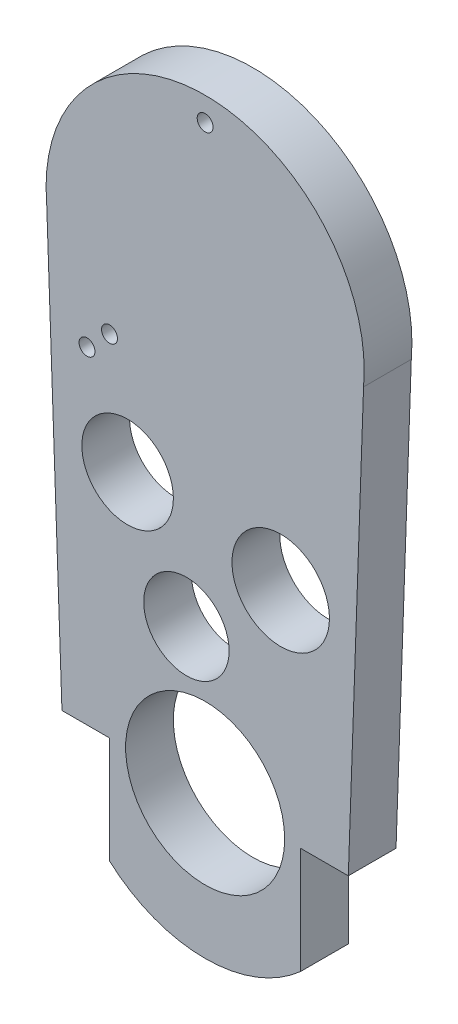
ISO-10303-21;
HEADER;
FILE_DESCRIPTION(('STEP AP214'),'2;1');
FILE_NAME('part.step','',(''),(''),'','','');
FILE_SCHEMA(('AUTOMOTIVE_DESIGN { 1 0 10303 214 1 1 1 1 }'));
ENDSEC;
DATA;
#1=APPLICATION_CONTEXT('core data for automotive mechanical design processes');
#2=APPLICATION_PROTOCOL_DEFINITION('international standard','automotive_design',2000,#1);
#3=PRODUCT_CONTEXT('',#1,'mechanical');
#4=PRODUCT('Part','Part','',(#3));
#5=PRODUCT_RELATED_PRODUCT_CATEGORY('part','',(#4));
#6=PRODUCT_DEFINITION_FORMATION('','',#4);
#7=PRODUCT_DEFINITION_CONTEXT('part definition',#1,'design');
#8=PRODUCT_DEFINITION('design','',#6,#7);
#9=PRODUCT_DEFINITION_SHAPE('','',#8);
#10=(LENGTH_UNIT() NAMED_UNIT(*) SI_UNIT(.MILLI.,.METRE.));
#11=(NAMED_UNIT(*) PLANE_ANGLE_UNIT() SI_UNIT($,.RADIAN.));
#12=(NAMED_UNIT(*) SI_UNIT($,.STERADIAN.) SOLID_ANGLE_UNIT());
#13=UNCERTAINTY_MEASURE_WITH_UNIT(LENGTH_MEASURE(1.E-05),#10,'distance_accuracy_value','');
#14=(GEOMETRIC_REPRESENTATION_CONTEXT(3) GLOBAL_UNCERTAINTY_ASSIGNED_CONTEXT((#13)) GLOBAL_UNIT_ASSIGNED_CONTEXT((#10,
#11,#12)) REPRESENTATION_CONTEXT('',''));
#15=CARTESIAN_POINT('',(0.,0.,0.));
#16=DIRECTION('',(0.,0.,1.));
#17=DIRECTION('',(1.,0.,0.));
#18=AXIS2_PLACEMENT_3D('',#15,#16,#17);
#19=CARTESIAN_POINT('',(0.,28.,3.));
#20=DIRECTION('',(0.,0.,-1.));
#21=DIRECTION('',(-1.,0.,0.));
#22=AXIS2_PLACEMENT_3D('',#19,#20,#21);
#23=PLANE('',#22);
#24=CARTESIAN_POINT('',(0.,28.,3.));
#25=DIRECTION('',(0.,0.,1.));
#26=DIRECTION('',(-1.,0.,0.));
#27=AXIS2_PLACEMENT_3D('',#24,#25,#26);
#28=CIRCLE('',#27,10.);
#29=CARTESIAN_POINT('',(9.95907170702906,27.0961799215256,3.));
#30=VERTEX_POINT('',#29);
#31=CARTESIAN_POINT('',(-9.95907170702906,27.0961799215256,3.));
#32=VERTEX_POINT('',#31);
#33=EDGE_CURVE('E151',#30,#32,#28,.T.);
#34=ORIENTED_EDGE('',*,*,#33,.T.);
#35=DIRECTION('',(0.0353729383723889,-0.999374181791236,0.));
#36=VECTOR('',#35,1.);
#37=CARTESIAN_POINT('',(-9.,0.,3.));
#38=LINE('',#37,#36);
#39=CARTESIAN_POINT('',(-9.,0.,3.));
#40=VERTEX_POINT('',#39);
#41=EDGE_CURVE('E99',#32,#40,#38,.T.);
#42=ORIENTED_EDGE('',*,*,#41,.T.);
#43=DIRECTION('',(1.,0.,0.));
#44=VECTOR('',#43,1.);
#45=CARTESIAN_POINT('',(-6.,0.,3.));
#46=LINE('',#45,#44);
#47=CARTESIAN_POINT('',(-6.,0.,3.));
#48=VERTEX_POINT('',#47);
#49=EDGE_CURVE('E166',#40,#48,#46,.T.);
#50=ORIENTED_EDGE('',*,*,#49,.T.);
#51=DIRECTION('',(0.,-1.,0.));
#52=VECTOR('',#51,1.);
#53=CARTESIAN_POINT('',(-6.,-6.70820393249937,3.));
#54=LINE('',#53,#52);
#55=CARTESIAN_POINT('',(-6.,-6.70820393249937,3.));
#56=VERTEX_POINT('',#55);
#57=EDGE_CURVE('E179',#48,#56,#54,.T.);
#58=ORIENTED_EDGE('',*,*,#57,.T.);
#59=CARTESIAN_POINT('',(0.,0.,3.));
#60=DIRECTION('',(0.,0.,1.));
#61=DIRECTION('',(1.,0.,0.));
#62=AXIS2_PLACEMENT_3D('',#59,#60,#61);
#63=CIRCLE('',#62,9.);
#64=CARTESIAN_POINT('',(6.,-6.70820393249937,3.));
#65=VERTEX_POINT('',#64);
#66=EDGE_CURVE('E118',#56,#65,#63,.T.);
#67=ORIENTED_EDGE('',*,*,#66,.T.);
#68=DIRECTION('',(0.,1.,0.));
#69=VECTOR('',#68,1.);
#70=CARTESIAN_POINT('',(6.,-6.70820393249937,3.));
#71=LINE('',#70,#69);
#72=CARTESIAN_POINT('',(6.,0.,3.));
#73=VERTEX_POINT('',#72);
#74=EDGE_CURVE('E112',#65,#73,#71,.T.);
#75=ORIENTED_EDGE('',*,*,#74,.T.);
#76=DIRECTION('',(1.,0.,0.));
#77=VECTOR('',#76,1.);
#78=CARTESIAN_POINT('',(6.,0.,3.));
#79=LINE('',#78,#77);
#80=CARTESIAN_POINT('',(9.,0.,3.));
#81=VERTEX_POINT('',#80);
#82=EDGE_CURVE('E116',#73,#81,#79,.T.);
#83=ORIENTED_EDGE('',*,*,#82,.T.);
#84=DIRECTION('',(0.0353729383723889,0.999374181791236,0.));
#85=VECTOR('',#84,1.);
#86=CARTESIAN_POINT('',(9.,0.,3.));
#87=LINE('',#86,#85);
#88=EDGE_CURVE('E56',#81,#30,#87,.T.);
#89=ORIENTED_EDGE('',*,*,#88,.T.);
#90=EDGE_LOOP('',(#34,#42,#50,#58,#67,#75,#83,#89));
#91=FACE_BOUND('',#90,.T.);
#92=CARTESIAN_POINT('',(0.,0.,3.));
#93=DIRECTION('',(0.,0.,1.));
#94=DIRECTION('',(1.,0.,0.));
#95=AXIS2_PLACEMENT_3D('',#92,#93,#94);
#96=CIRCLE('',#95,5.);
#97=CARTESIAN_POINT('',(5.,0.,3.));
#98=VERTEX_POINT('',#97);
#99=EDGE_CURVE('E140',#98,#98,#96,.T.);
#100=ORIENTED_EDGE('',*,*,#99,.F.);
#101=EDGE_LOOP('',(#100));
#102=FACE_BOUND('',#101,.T.);
#103=CARTESIAN_POINT('',(-4.87423041916293,15.0480677752898,3.));
#104=DIRECTION('',(0.,0.,1.));
#105=DIRECTION('',(1.,0.,0.));
#106=AXIS2_PLACEMENT_3D('',#103,#104,#105);
#107=CIRCLE('',#106,2.87750647764229);
#108=CARTESIAN_POINT('',(-1.99672394152064,15.0480677752898,3.));
#109=VERTEX_POINT('',#108);
#110=EDGE_CURVE('E188',#109,#109,#107,.T.);
#111=ORIENTED_EDGE('',*,*,#110,.F.);
#112=EDGE_LOOP('',(#111));
#113=FACE_BOUND('',#112,.T.);
#114=CARTESIAN_POINT('',(4.75073652574446,13.4161529645615,3.));
#115=DIRECTION('',(0.,0.,1.));
#116=DIRECTION('',(1.,0.,0.));
#117=AXIS2_PLACEMENT_3D('',#114,#115,#116);
#118=CIRCLE('',#117,3.0634845054764);
#119=CARTESIAN_POINT('',(7.81422103122086,13.4161529645615,3.));
#120=VERTEX_POINT('',#119);
#121=EDGE_CURVE('E194',#120,#120,#118,.T.);
#122=ORIENTED_EDGE('',*,*,#121,.F.);
#123=EDGE_LOOP('',(#122));
#124=FACE_BOUND('',#123,.T.);
#125=CARTESIAN_POINT('',(-1.17744380710507,8.48710414848437,3.));
#126=DIRECTION('',(0.,0.,1.));
#127=DIRECTION('',(1.,0.,0.));
#128=AXIS2_PLACEMENT_3D('',#125,#126,#127);
#129=CIRCLE('',#128,2.6843256323907);
#130=CARTESIAN_POINT('',(1.50688182528563,8.48710414848437,3.));
#131=VERTEX_POINT('',#130);
#132=EDGE_CURVE('E200',#131,#131,#129,.T.);
#133=ORIENTED_EDGE('',*,*,#132,.F.);
#134=EDGE_LOOP('',(#133));
#135=FACE_BOUND('',#134,.T.);
#136=CARTESIAN_POINT('',(-6.01040764008566,21.9895923599144,3.));
#137=DIRECTION('',(0.,0.,1.));
#138=DIRECTION('',(1.,0.,0.));
#139=AXIS2_PLACEMENT_3D('',#136,#137,#138);
#140=CIRCLE('',#139,0.500000000000002);
#141=CARTESIAN_POINT('',(-5.51040764008566,21.9895923599144,3.));
#142=VERTEX_POINT('',#141);
#143=EDGE_CURVE('E206',#142,#142,#140,.T.);
#144=ORIENTED_EDGE('',*,*,#143,.F.);
#145=EDGE_LOOP('',(#144));
#146=FACE_BOUND('',#145,.T.);
#147=CARTESIAN_POINT('',(-7.42462120245876,20.5753787975413,3.));
#148=DIRECTION('',(0.,0.,1.));
#149=DIRECTION('',(1.,0.,0.));
#150=AXIS2_PLACEMENT_3D('',#147,#148,#149);
#151=CIRCLE('',#150,0.500000000000002);
#152=CARTESIAN_POINT('',(-6.92462120245876,20.5753787975413,3.));
#153=VERTEX_POINT('',#152);
#154=EDGE_CURVE('E212',#153,#153,#151,.T.);
#155=ORIENTED_EDGE('',*,*,#154,.F.);
#156=EDGE_LOOP('',(#155));
#157=FACE_BOUND('',#156,.T.);
#158=CARTESIAN_POINT('',(0.,36.5,3.));
#159=DIRECTION('',(0.,0.,1.));
#160=DIRECTION('',(1.,0.,0.));
#161=AXIS2_PLACEMENT_3D('',#158,#159,#160);
#162=CIRCLE('',#161,0.5);
#163=CARTESIAN_POINT('',(0.5,36.5,3.));
#164=VERTEX_POINT('',#163);
#165=EDGE_CURVE('E218',#164,#164,#162,.T.);
#166=ORIENTED_EDGE('',*,*,#165,.F.);
#167=EDGE_LOOP('',(#166));
#168=FACE_BOUND('',#167,.T.);
#169=ADVANCED_FACE('F39',(#91,#102,#113,#124,#135,#146,#157,#168),#23,.F.);
#170=CARTESIAN_POINT('',(0.,28.,0.));
#171=DIRECTION('',(0.,0.,-1.));
#172=DIRECTION('',(-1.,0.,0.));
#173=AXIS2_PLACEMENT_3D('',#170,#171,#172);
#174=PLANE('',#173);
#175=CARTESIAN_POINT('',(-7.42462120245876,20.5753787975413,0.));
#176=DIRECTION('',(0.,0.,1.));
#177=DIRECTION('',(1.,0.,0.));
#178=AXIS2_PLACEMENT_3D('',#175,#176,#177);
#179=CIRCLE('',#178,0.500000000000002);
#180=CARTESIAN_POINT('',(-6.92462120245876,20.5753787975413,0.));
#181=VERTEX_POINT('',#180);
#182=EDGE_CURVE('E215',#181,#181,#179,.T.);
#183=ORIENTED_EDGE('',*,*,#182,.T.);
#184=EDGE_LOOP('',(#183));
#185=FACE_BOUND('',#184,.T.);
#186=CARTESIAN_POINT('',(-1.17744380710507,8.48710414848437,0.));
#187=DIRECTION('',(0.,0.,1.));
#188=DIRECTION('',(1.,0.,0.));
#189=AXIS2_PLACEMENT_3D('',#186,#187,#188);
#190=CIRCLE('',#189,2.6843256323907);
#191=CARTESIAN_POINT('',(1.50688182528563,8.48710414848437,0.));
#192=VERTEX_POINT('',#191);
#193=EDGE_CURVE('E203',#192,#192,#190,.T.);
#194=ORIENTED_EDGE('',*,*,#193,.T.);
#195=EDGE_LOOP('',(#194));
#196=FACE_BOUND('',#195,.T.);
#197=CARTESIAN_POINT('',(-4.87423041916293,15.0480677752898,0.));
#198=DIRECTION('',(0.,0.,1.));
#199=DIRECTION('',(1.,0.,0.));
#200=AXIS2_PLACEMENT_3D('',#197,#198,#199);
#201=CIRCLE('',#200,2.87750647764229);
#202=CARTESIAN_POINT('',(-1.99672394152064,15.0480677752898,0.));
#203=VERTEX_POINT('',#202);
#204=EDGE_CURVE('E191',#203,#203,#201,.T.);
#205=ORIENTED_EDGE('',*,*,#204,.T.);
#206=EDGE_LOOP('',(#205));
#207=FACE_BOUND('',#206,.T.);
#208=CARTESIAN_POINT('',(0.,28.,0.));
#209=DIRECTION('',(0.,0.,1.));
#210=DIRECTION('',(-1.,0.,0.));
#211=AXIS2_PLACEMENT_3D('',#208,#209,#210);
#212=CIRCLE('',#211,10.);
#213=CARTESIAN_POINT('',(9.95907170702906,27.0961799215256,0.));
#214=VERTEX_POINT('',#213);
#215=CARTESIAN_POINT('',(-9.95907170702906,27.0961799215256,0.));
#216=VERTEX_POINT('',#215);
#217=EDGE_CURVE('E136',#214,#216,#212,.T.);
#218=ORIENTED_EDGE('',*,*,#217,.F.);
#219=DIRECTION('',(0.0353729383723889,0.999374181791236,0.));
#220=VECTOR('',#219,1.);
#221=CARTESIAN_POINT('',(9.,0.,0.));
#222=LINE('',#221,#220);
#223=CARTESIAN_POINT('',(9.,0.,0.));
#224=VERTEX_POINT('',#223);
#225=EDGE_CURVE('E91',#224,#214,#222,.T.);
#226=ORIENTED_EDGE('',*,*,#225,.F.);
#227=DIRECTION('',(1.,0.,0.));
#228=VECTOR('',#227,1.);
#229=CARTESIAN_POINT('',(6.,0.,0.));
#230=LINE('',#229,#228);
#231=CARTESIAN_POINT('',(6.,0.,0.));
#232=VERTEX_POINT('',#231);
#233=EDGE_CURVE('E85',#232,#224,#230,.T.);
#234=ORIENTED_EDGE('',*,*,#233,.F.);
#235=DIRECTION('',(0.,1.,0.));
#236=VECTOR('',#235,1.);
#237=CARTESIAN_POINT('',(6.,-6.70820393249937,0.));
#238=LINE('',#237,#236);
#239=CARTESIAN_POINT('',(6.,-6.70820393249937,0.));
#240=VERTEX_POINT('',#239);
#241=EDGE_CURVE('E126',#240,#232,#238,.T.);
#242=ORIENTED_EDGE('',*,*,#241,.F.);
#243=CARTESIAN_POINT('',(0.,0.,0.));
#244=DIRECTION('',(0.,0.,1.));
#245=DIRECTION('',(1.,0.,0.));
#246=AXIS2_PLACEMENT_3D('',#243,#244,#245);
#247=CIRCLE('',#246,9.);
#248=CARTESIAN_POINT('',(-6.,-6.70820393249937,0.));
#249=VERTEX_POINT('',#248);
#250=EDGE_CURVE('E146',#249,#240,#247,.T.);
#251=ORIENTED_EDGE('',*,*,#250,.F.);
#252=DIRECTION('',(0.,-1.,0.));
#253=VECTOR('',#252,1.);
#254=CARTESIAN_POINT('',(-6.,-6.70820393249937,0.));
#255=LINE('',#254,#253);
#256=CARTESIAN_POINT('',(-6.,0.,0.));
#257=VERTEX_POINT('',#256);
#258=EDGE_CURVE('E144',#257,#249,#255,.T.);
#259=ORIENTED_EDGE('',*,*,#258,.F.);
#260=DIRECTION('',(1.,0.,0.));
#261=VECTOR('',#260,1.);
#262=CARTESIAN_POINT('',(-6.,0.,0.));
#263=LINE('',#262,#261);
#264=CARTESIAN_POINT('',(-9.,0.,0.));
#265=VERTEX_POINT('',#264);
#266=EDGE_CURVE('E142',#265,#257,#263,.T.);
#267=ORIENTED_EDGE('',*,*,#266,.F.);
#268=DIRECTION('',(0.0353729383723889,-0.999374181791236,0.));
#269=VECTOR('',#268,1.);
#270=CARTESIAN_POINT('',(-9.,0.,0.));
#271=LINE('',#270,#269);
#272=EDGE_CURVE('E139',#216,#265,#271,.T.);
#273=ORIENTED_EDGE('',*,*,#272,.F.);
#274=EDGE_LOOP('',(#218,#226,#234,#242,#251,#259,#267,#273));
#275=FACE_BOUND('',#274,.T.);
#276=CARTESIAN_POINT('',(0.,0.,0.));
#277=DIRECTION('',(0.,0.,1.));
#278=DIRECTION('',(1.,0.,0.));
#279=AXIS2_PLACEMENT_3D('',#276,#277,#278);
#280=CIRCLE('',#279,5.);
#281=CARTESIAN_POINT('',(5.,0.,0.));
#282=VERTEX_POINT('',#281);
#283=EDGE_CURVE('E185',#282,#282,#280,.T.);
#284=ORIENTED_EDGE('',*,*,#283,.T.);
#285=EDGE_LOOP('',(#284));
#286=FACE_BOUND('',#285,.T.);
#287=CARTESIAN_POINT('',(4.75073652574446,13.4161529645615,0.));
#288=DIRECTION('',(0.,0.,1.));
#289=DIRECTION('',(1.,0.,0.));
#290=AXIS2_PLACEMENT_3D('',#287,#288,#289);
#291=CIRCLE('',#290,3.0634845054764);
#292=CARTESIAN_POINT('',(7.81422103122086,13.4161529645615,0.));
#293=VERTEX_POINT('',#292);
#294=EDGE_CURVE('E197',#293,#293,#291,.T.);
#295=ORIENTED_EDGE('',*,*,#294,.T.);
#296=EDGE_LOOP('',(#295));
#297=FACE_BOUND('',#296,.T.);
#298=CARTESIAN_POINT('',(-6.01040764008566,21.9895923599144,0.));
#299=DIRECTION('',(0.,0.,1.));
#300=DIRECTION('',(1.,0.,0.));
#301=AXIS2_PLACEMENT_3D('',#298,#299,#300);
#302=CIRCLE('',#301,0.500000000000002);
#303=CARTESIAN_POINT('',(-5.51040764008566,21.9895923599144,0.));
#304=VERTEX_POINT('',#303);
#305=EDGE_CURVE('E209',#304,#304,#302,.T.);
#306=ORIENTED_EDGE('',*,*,#305,.T.);
#307=EDGE_LOOP('',(#306));
#308=FACE_BOUND('',#307,.T.);
#309=CARTESIAN_POINT('',(0.,36.5,0.));
#310=DIRECTION('',(0.,0.,1.));
#311=DIRECTION('',(1.,0.,0.));
#312=AXIS2_PLACEMENT_3D('',#309,#310,#311);
#313=CIRCLE('',#312,0.5);
#314=CARTESIAN_POINT('',(0.5,36.5,0.));
#315=VERTEX_POINT('',#314);
#316=EDGE_CURVE('E221',#315,#315,#313,.T.);
#317=ORIENTED_EDGE('',*,*,#316,.T.);
#318=EDGE_LOOP('',(#317));
#319=FACE_BOUND('',#318,.T.);
#320=ADVANCED_FACE('F170',(#185,#196,#207,#275,#286,#297,#308,#319),#174,.T.);
#321=CARTESIAN_POINT('',(0.,28.,3.));
#322=DIRECTION('',(0.,0.,-1.));
#323=DIRECTION('',(-1.,0.,0.));
#324=AXIS2_PLACEMENT_3D('',#321,#322,#323);
#325=CYLINDRICAL_SURFACE('',#324,10.);
#326=ORIENTED_EDGE('',*,*,#217,.T.);
#327=DIRECTION('',(0.,0.,-1.));
#328=VECTOR('',#327,1.);
#329=CARTESIAN_POINT('',(-9.95907170702906,27.0961799215256,3.));
#330=LINE('',#329,#328);
#331=EDGE_CURVE('E11',#32,#216,#330,.T.);
#332=ORIENTED_EDGE('',*,*,#331,.F.);
#333=ORIENTED_EDGE('',*,*,#33,.F.);
#334=DIRECTION('',(0.,0.,-1.));
#335=VECTOR('',#334,1.);
#336=CARTESIAN_POINT('',(9.95907170702906,27.0961799215256,3.));
#337=LINE('',#336,#335);
#338=EDGE_CURVE('E132',#30,#214,#337,.T.);
#339=ORIENTED_EDGE('',*,*,#338,.T.);
#340=EDGE_LOOP('',(#326,#332,#333,#339));
#341=FACE_BOUND('',#340,.T.);
#342=ADVANCED_FACE('F41',(#341),#325,.T.);
#343=CARTESIAN_POINT('',(-9.,0.,3.));
#344=DIRECTION('',(0.999374181791236,0.0353729383723889,0.));
#345=DIRECTION('',(-0.0353729383723889,0.999374181791236,0.));
#346=AXIS2_PLACEMENT_3D('',#343,#344,#345);
#347=PLANE('',#346);
#348=ORIENTED_EDGE('',*,*,#272,.T.);
#349=DIRECTION('',(0.,0.,-1.));
#350=VECTOR('',#349,1.);
#351=CARTESIAN_POINT('',(-9.,0.,3.));
#352=LINE('',#351,#350);
#353=EDGE_CURVE('E48',#40,#265,#352,.T.);
#354=ORIENTED_EDGE('',*,*,#353,.F.);
#355=ORIENTED_EDGE('',*,*,#41,.F.);
#356=ORIENTED_EDGE('',*,*,#331,.T.);
#357=EDGE_LOOP('',(#348,#354,#355,#356));
#358=FACE_BOUND('',#357,.T.);
#359=ADVANCED_FACE('F253',(#358),#347,.F.);
#360=CARTESIAN_POINT('',(-6.,0.,3.));
#361=DIRECTION('',(0.,1.,0.));
#362=DIRECTION('',(0.,0.,1.));
#363=AXIS2_PLACEMENT_3D('',#360,#361,#362);
#364=PLANE('',#363);
#365=ORIENTED_EDGE('',*,*,#266,.T.);
#366=DIRECTION('',(0.,0.,-1.));
#367=VECTOR('',#366,1.);
#368=CARTESIAN_POINT('',(-6.,0.,3.));
#369=LINE('',#368,#367);
#370=EDGE_CURVE('E158',#48,#257,#369,.T.);
#371=ORIENTED_EDGE('',*,*,#370,.F.);
#372=ORIENTED_EDGE('',*,*,#49,.F.);
#373=ORIENTED_EDGE('',*,*,#353,.T.);
#374=EDGE_LOOP('',(#365,#371,#372,#373));
#375=FACE_BOUND('',#374,.T.);
#376=ADVANCED_FACE('F164',(#375),#364,.F.);
#377=CARTESIAN_POINT('',(-6.,-6.70820393249937,3.));
#378=DIRECTION('',(1.,0.,0.));
#379=DIRECTION('',(0.,0.,-1.));
#380=AXIS2_PLACEMENT_3D('',#377,#378,#379);
#381=PLANE('',#380);
#382=ORIENTED_EDGE('',*,*,#258,.T.);
#383=DIRECTION('',(0.,0.,-1.));
#384=VECTOR('',#383,1.);
#385=CARTESIAN_POINT('',(-6.,-6.70820393249937,3.));
#386=LINE('',#385,#384);
#387=EDGE_CURVE('E155',#56,#249,#386,.T.);
#388=ORIENTED_EDGE('',*,*,#387,.F.);
#389=ORIENTED_EDGE('',*,*,#57,.F.);
#390=ORIENTED_EDGE('',*,*,#370,.T.);
#391=EDGE_LOOP('',(#382,#388,#389,#390));
#392=FACE_BOUND('',#391,.T.);
#393=ADVANCED_FACE('F175',(#392),#381,.F.);
#394=CARTESIAN_POINT('',(0.,0.,3.));
#395=DIRECTION('',(0.,0.,-1.));
#396=DIRECTION('',(-1.,0.,0.));
#397=AXIS2_PLACEMENT_3D('',#394,#395,#396);
#398=CYLINDRICAL_SURFACE('',#397,9.);
#399=ORIENTED_EDGE('',*,*,#250,.T.);
#400=DIRECTION('',(0.,0.,-1.));
#401=VECTOR('',#400,1.);
#402=CARTESIAN_POINT('',(6.,-6.70820393249937,3.));
#403=LINE('',#402,#401);
#404=EDGE_CURVE('E127',#65,#240,#403,.T.);
#405=ORIENTED_EDGE('',*,*,#404,.F.);
#406=ORIENTED_EDGE('',*,*,#66,.F.);
#407=ORIENTED_EDGE('',*,*,#387,.T.);
#408=EDGE_LOOP('',(#399,#405,#406,#407));
#409=FACE_BOUND('',#408,.T.);
#410=ADVANCED_FACE('F178',(#409),#398,.T.);
#411=CARTESIAN_POINT('',(6.,-6.70820393249937,3.));
#412=DIRECTION('',(-1.,0.,0.));
#413=DIRECTION('',(0.,0.,1.));
#414=AXIS2_PLACEMENT_3D('',#411,#412,#413);
#415=PLANE('',#414);
#416=ORIENTED_EDGE('',*,*,#241,.T.);
#417=DIRECTION('',(0.,0.,-1.));
#418=VECTOR('',#417,1.);
#419=CARTESIAN_POINT('',(6.,0.,3.));
#420=LINE('',#419,#418);
#421=EDGE_CURVE('E123',#73,#232,#420,.T.);
#422=ORIENTED_EDGE('',*,*,#421,.F.);
#423=ORIENTED_EDGE('',*,*,#74,.F.);
#424=ORIENTED_EDGE('',*,*,#404,.T.);
#425=EDGE_LOOP('',(#416,#422,#423,#424));
#426=FACE_BOUND('',#425,.T.);
#427=ADVANCED_FACE('F124',(#426),#415,.F.);
#428=CARTESIAN_POINT('',(6.,0.,3.));
#429=DIRECTION('',(0.,1.,0.));
#430=DIRECTION('',(0.,0.,1.));
#431=AXIS2_PLACEMENT_3D('',#428,#429,#430);
#432=PLANE('',#431);
#433=ORIENTED_EDGE('',*,*,#233,.T.);
#434=DIRECTION('',(0.,0.,-1.));
#435=VECTOR('',#434,1.);
#436=CARTESIAN_POINT('',(9.,0.,3.));
#437=LINE('',#436,#435);
#438=EDGE_CURVE('E128',#81,#224,#437,.T.);
#439=ORIENTED_EDGE('',*,*,#438,.F.);
#440=ORIENTED_EDGE('',*,*,#82,.F.);
#441=ORIENTED_EDGE('',*,*,#421,.T.);
#442=EDGE_LOOP('',(#433,#439,#440,#441));
#443=FACE_BOUND('',#442,.T.);
#444=ADVANCED_FACE('F130',(#443),#432,.F.);
#445=CARTESIAN_POINT('',(9.,0.,3.));
#446=DIRECTION('',(-0.999374181791236,0.0353729383723889,0.));
#447=DIRECTION('',(-0.0353729383723889,-0.999374181791236,0.));
#448=AXIS2_PLACEMENT_3D('',#445,#446,#447);
#449=PLANE('',#448);
#450=ORIENTED_EDGE('',*,*,#225,.T.);
#451=ORIENTED_EDGE('',*,*,#338,.F.);
#452=ORIENTED_EDGE('',*,*,#88,.F.);
#453=ORIENTED_EDGE('',*,*,#438,.T.);
#454=EDGE_LOOP('',(#450,#451,#452,#453));
#455=FACE_BOUND('',#454,.T.);
#456=ADVANCED_FACE('F241',(#455),#449,.F.);
#457=CARTESIAN_POINT('',(0.,0.,3.));
#458=DIRECTION('',(0.,0.,-1.));
#459=DIRECTION('',(-1.,0.,0.));
#460=AXIS2_PLACEMENT_3D('',#457,#458,#459);
#461=CYLINDRICAL_SURFACE('',#460,5.);
#462=ORIENTED_EDGE('',*,*,#99,.T.);
#463=EDGE_LOOP('',(#462));
#464=FACE_BOUND('',#463,.T.);
#465=ORIENTED_EDGE('',*,*,#283,.F.);
#466=EDGE_LOOP('',(#465));
#467=FACE_BOUND('',#466,.T.);
#468=ADVANCED_FACE('F238',(#464,#467),#461,.F.);
#469=CARTESIAN_POINT('',(-4.87423041916293,15.0480677752898,3.));
#470=DIRECTION('',(0.,0.,-1.));
#471=DIRECTION('',(-1.,0.,0.));
#472=AXIS2_PLACEMENT_3D('',#469,#470,#471);
#473=CYLINDRICAL_SURFACE('',#472,2.87750647764229);
#474=ORIENTED_EDGE('',*,*,#110,.T.);
#475=EDGE_LOOP('',(#474));
#476=FACE_BOUND('',#475,.T.);
#477=ORIENTED_EDGE('',*,*,#204,.F.);
#478=EDGE_LOOP('',(#477));
#479=FACE_BOUND('',#478,.T.);
#480=ADVANCED_FACE('F316',(#476,#479),#473,.F.);
#481=CARTESIAN_POINT('',(4.75073652574446,13.4161529645615,3.));
#482=DIRECTION('',(0.,0.,-1.));
#483=DIRECTION('',(-1.,0.,0.));
#484=AXIS2_PLACEMENT_3D('',#481,#482,#483);
#485=CYLINDRICAL_SURFACE('',#484,3.0634845054764);
#486=ORIENTED_EDGE('',*,*,#121,.T.);
#487=EDGE_LOOP('',(#486));
#488=FACE_BOUND('',#487,.T.);
#489=ORIENTED_EDGE('',*,*,#294,.F.);
#490=EDGE_LOOP('',(#489));
#491=FACE_BOUND('',#490,.T.);
#492=ADVANCED_FACE('F324',(#488,#491),#485,.F.);
#493=CARTESIAN_POINT('',(-1.17744380710507,8.48710414848437,3.));
#494=DIRECTION('',(0.,0.,-1.));
#495=DIRECTION('',(-1.,0.,0.));
#496=AXIS2_PLACEMENT_3D('',#493,#494,#495);
#497=CYLINDRICAL_SURFACE('',#496,2.6843256323907);
#498=ORIENTED_EDGE('',*,*,#132,.T.);
#499=EDGE_LOOP('',(#498));
#500=FACE_BOUND('',#499,.T.);
#501=ORIENTED_EDGE('',*,*,#193,.F.);
#502=EDGE_LOOP('',(#501));
#503=FACE_BOUND('',#502,.T.);
#504=ADVANCED_FACE('F332',(#500,#503),#497,.F.);
#505=CARTESIAN_POINT('',(-6.01040764008566,21.9895923599144,3.));
#506=DIRECTION('',(0.,0.,-1.));
#507=DIRECTION('',(-1.,0.,0.));
#508=AXIS2_PLACEMENT_3D('',#505,#506,#507);
#509=CYLINDRICAL_SURFACE('',#508,0.500000000000002);
#510=ORIENTED_EDGE('',*,*,#143,.T.);
#511=EDGE_LOOP('',(#510));
#512=FACE_BOUND('',#511,.T.);
#513=ORIENTED_EDGE('',*,*,#305,.F.);
#514=EDGE_LOOP('',(#513));
#515=FACE_BOUND('',#514,.T.);
#516=ADVANCED_FACE('F341',(#512,#515),#509,.F.);
#517=CARTESIAN_POINT('',(-7.42462120245876,20.5753787975413,3.));
#518=DIRECTION('',(0.,0.,-1.));
#519=DIRECTION('',(-1.,0.,0.));
#520=AXIS2_PLACEMENT_3D('',#517,#518,#519);
#521=CYLINDRICAL_SURFACE('',#520,0.500000000000002);
#522=ORIENTED_EDGE('',*,*,#154,.T.);
#523=EDGE_LOOP('',(#522));
#524=FACE_BOUND('',#523,.T.);
#525=ORIENTED_EDGE('',*,*,#182,.F.);
#526=EDGE_LOOP('',(#525));
#527=FACE_BOUND('',#526,.T.);
#528=ADVANCED_FACE('F350',(#524,#527),#521,.F.);
#529=CARTESIAN_POINT('',(0.,36.5,3.));
#530=DIRECTION('',(0.,0.,-1.));
#531=DIRECTION('',(-1.,0.,0.));
#532=AXIS2_PLACEMENT_3D('',#529,#530,#531);
#533=CYLINDRICAL_SURFACE('',#532,0.5);
#534=ORIENTED_EDGE('',*,*,#165,.T.);
#535=EDGE_LOOP('',(#534));
#536=FACE_BOUND('',#535,.T.);
#537=ORIENTED_EDGE('',*,*,#316,.F.);
#538=EDGE_LOOP('',(#537));
#539=FACE_BOUND('',#538,.T.);
#540=ADVANCED_FACE('F227',(#536,#539),#533,.F.);
#541=CLOSED_SHELL('',(#169,#320,#342,#359,#376,#393,#410,#427,#444,#456,#468,#480,#492,#504,
#516,#528,#540));
#542=MANIFOLD_SOLID_BREP('B2',#541);
#543=ADVANCED_BREP_SHAPE_REPRESENTATION('',(#18,#542),#14);
#544=SHAPE_DEFINITION_REPRESENTATION(#9,#543);
ENDSEC;
END-ISO-10303-21;
